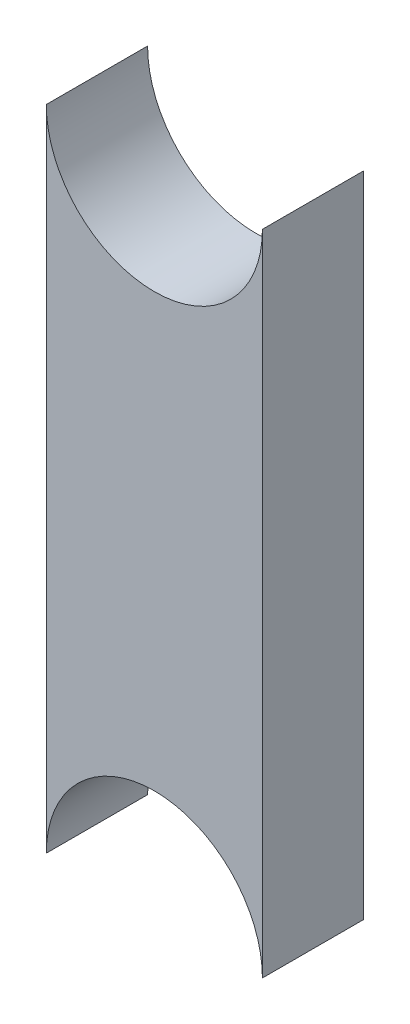
ISO-10303-21;
HEADER;
FILE_DESCRIPTION(('STEP AP214'),'2;1');
FILE_NAME('part.step','',(''),(''),'','','');
FILE_SCHEMA(('AUTOMOTIVE_DESIGN { 1 0 10303 214 1 1 1 1 }'));
ENDSEC;
DATA;
#1=APPLICATION_CONTEXT('core data for automotive mechanical design processes');
#2=APPLICATION_PROTOCOL_DEFINITION('international standard','automotive_design',2000,#1);
#3=PRODUCT_CONTEXT('',#1,'mechanical');
#4=PRODUCT('Part','Part','',(#3));
#5=PRODUCT_RELATED_PRODUCT_CATEGORY('part','',(#4));
#6=PRODUCT_DEFINITION_FORMATION('','',#4);
#7=PRODUCT_DEFINITION_CONTEXT('part definition',#1,'design');
#8=PRODUCT_DEFINITION('design','',#6,#7);
#9=PRODUCT_DEFINITION_SHAPE('','',#8);
#10=(LENGTH_UNIT() NAMED_UNIT(*) SI_UNIT(.MILLI.,.METRE.));
#11=(NAMED_UNIT(*) PLANE_ANGLE_UNIT() SI_UNIT($,.RADIAN.));
#12=(NAMED_UNIT(*) SI_UNIT($,.STERADIAN.) SOLID_ANGLE_UNIT());
#13=UNCERTAINTY_MEASURE_WITH_UNIT(LENGTH_MEASURE(1.E-05),#10,'distance_accuracy_value','');
#14=(GEOMETRIC_REPRESENTATION_CONTEXT(3) GLOBAL_UNCERTAINTY_ASSIGNED_CONTEXT((#13)) GLOBAL_UNIT_ASSIGNED_CONTEXT((#10,
#11,#12)) REPRESENTATION_CONTEXT('',''));
#15=CARTESIAN_POINT('',(0.,0.,0.));
#16=DIRECTION('',(0.,0.,1.));
#17=DIRECTION('',(1.,0.,0.));
#18=AXIS2_PLACEMENT_3D('',#15,#16,#17);
#19=CARTESIAN_POINT('',(0.,19.2,3.));
#20=DIRECTION('',(0.,0.,-1.));
#21=DIRECTION('',(-1.,0.,0.));
#22=AXIS2_PLACEMENT_3D('',#19,#20,#21);
#23=CYLINDRICAL_SURFACE('',#22,3.2);
#24=CARTESIAN_POINT('',(0.,19.2,0.));
#25=DIRECTION('',(0.,0.,-1.));
#26=DIRECTION('',(1.,0.,0.));
#27=AXIS2_PLACEMENT_3D('',#24,#25,#26);
#28=CIRCLE('',#27,3.2);
#29=CARTESIAN_POINT('',(3.2,19.2,0.));
#30=VERTEX_POINT('',#29);
#31=CARTESIAN_POINT('',(-3.2,19.2,0.));
#32=VERTEX_POINT('',#31);
#33=EDGE_CURVE('E102',#30,#32,#28,.T.);
#34=ORIENTED_EDGE('',*,*,#33,.T.);
#35=DIRECTION('',(0.,0.,-1.));
#36=VECTOR('',#35,1.);
#37=CARTESIAN_POINT('',(-3.2,19.2,3.));
#38=LINE('',#37,#36);
#39=CARTESIAN_POINT('',(-3.2,19.2,3.));
#40=VERTEX_POINT('',#39);
#41=EDGE_CURVE('E11',#40,#32,#38,.T.);
#42=ORIENTED_EDGE('',*,*,#41,.F.);
#43=CARTESIAN_POINT('',(0.,19.2,3.));
#44=DIRECTION('',(0.,0.,-1.));
#45=DIRECTION('',(1.,0.,0.));
#46=AXIS2_PLACEMENT_3D('',#43,#44,#45);
#47=CIRCLE('',#46,3.2);
#48=CARTESIAN_POINT('',(3.2,19.2,3.));
#49=VERTEX_POINT('',#48);
#50=EDGE_CURVE('E90',#49,#40,#47,.T.);
#51=ORIENTED_EDGE('',*,*,#50,.F.);
#52=DIRECTION('',(0.,0.,-1.));
#53=VECTOR('',#52,1.);
#54=CARTESIAN_POINT('',(3.2,19.2,3.));
#55=LINE('',#54,#53);
#56=EDGE_CURVE('E98',#49,#30,#55,.T.);
#57=ORIENTED_EDGE('',*,*,#56,.T.);
#58=EDGE_LOOP('',(#34,#42,#51,#57));
#59=FACE_BOUND('',#58,.T.);
#60=ADVANCED_FACE('F39',(#59),#23,.F.);
#61=CARTESIAN_POINT('',(-3.2,0.,3.));
#62=DIRECTION('',(1.,0.,0.));
#63=DIRECTION('',(0.,0.,-1.));
#64=AXIS2_PLACEMENT_3D('',#61,#62,#63);
#65=PLANE('',#64);
#66=DIRECTION('',(0.,-1.,0.));
#67=VECTOR('',#66,1.);
#68=CARTESIAN_POINT('',(-3.2,0.,0.));
#69=LINE('',#68,#67);
#70=CARTESIAN_POINT('',(-3.2,0.,0.));
#71=VERTEX_POINT('',#70);
#72=EDGE_CURVE('E94',#32,#71,#69,.T.);
#73=ORIENTED_EDGE('',*,*,#72,.T.);
#74=DIRECTION('',(0.,0.,-1.));
#75=VECTOR('',#74,1.);
#76=CARTESIAN_POINT('',(-3.2,0.,3.));
#77=LINE('',#76,#75);
#78=CARTESIAN_POINT('',(-3.2,0.,3.));
#79=VERTEX_POINT('',#78);
#80=EDGE_CURVE('E47',#79,#71,#77,.T.);
#81=ORIENTED_EDGE('',*,*,#80,.F.);
#82=DIRECTION('',(0.,-1.,0.));
#83=VECTOR('',#82,1.);
#84=CARTESIAN_POINT('',(-3.2,0.,3.));
#85=LINE('',#84,#83);
#86=EDGE_CURVE('E85',#40,#79,#85,.T.);
#87=ORIENTED_EDGE('',*,*,#86,.F.);
#88=ORIENTED_EDGE('',*,*,#41,.T.);
#89=EDGE_LOOP('',(#73,#81,#87,#88));
#90=FACE_BOUND('',#89,.T.);
#91=ADVANCED_FACE('F93',(#90),#65,.F.);
#92=CARTESIAN_POINT('',(0.,0.,3.));
#93=DIRECTION('',(0.,0.,-1.));
#94=DIRECTION('',(-1.,0.,0.));
#95=AXIS2_PLACEMENT_3D('',#92,#93,#94);
#96=CYLINDRICAL_SURFACE('',#95,3.2);
#97=CARTESIAN_POINT('',(0.,0.,0.));
#98=DIRECTION('',(0.,0.,-1.));
#99=DIRECTION('',(1.,0.,0.));
#100=AXIS2_PLACEMENT_3D('',#97,#98,#99);
#101=CIRCLE('',#100,3.2);
#102=CARTESIAN_POINT('',(3.2,0.,0.));
#103=VERTEX_POINT('',#102);
#104=EDGE_CURVE('E72',#71,#103,#101,.T.);
#105=ORIENTED_EDGE('',*,*,#104,.T.);
#106=DIRECTION('',(0.,0.,-1.));
#107=VECTOR('',#106,1.);
#108=CARTESIAN_POINT('',(3.2,0.,3.));
#109=LINE('',#108,#107);
#110=CARTESIAN_POINT('',(3.2,0.,3.));
#111=VERTEX_POINT('',#110);
#112=EDGE_CURVE('E95',#111,#103,#109,.T.);
#113=ORIENTED_EDGE('',*,*,#112,.F.);
#114=CARTESIAN_POINT('',(0.,0.,3.));
#115=DIRECTION('',(0.,0.,-1.));
#116=DIRECTION('',(1.,0.,0.));
#117=AXIS2_PLACEMENT_3D('',#114,#115,#116);
#118=CIRCLE('',#117,3.2);
#119=EDGE_CURVE('E88',#79,#111,#118,.T.);
#120=ORIENTED_EDGE('',*,*,#119,.F.);
#121=ORIENTED_EDGE('',*,*,#80,.T.);
#122=EDGE_LOOP('',(#105,#113,#120,#121));
#123=FACE_BOUND('',#122,.T.);
#124=ADVANCED_FACE('F96',(#123),#96,.F.);
#125=CARTESIAN_POINT('',(3.2,19.2,3.));
#126=DIRECTION('',(-1.,0.,0.));
#127=DIRECTION('',(0.,-1.,0.));
#128=AXIS2_PLACEMENT_3D('',#125,#126,#127);
#129=PLANE('',#128);
#130=DIRECTION('',(0.,1.,0.));
#131=VECTOR('',#130,1.);
#132=CARTESIAN_POINT('',(3.2,19.2,0.));
#133=LINE('',#132,#131);
#134=EDGE_CURVE('E78',#103,#30,#133,.T.);
#135=ORIENTED_EDGE('',*,*,#134,.T.);
#136=ORIENTED_EDGE('',*,*,#56,.F.);
#137=DIRECTION('',(0.,1.,0.));
#138=VECTOR('',#137,1.);
#139=CARTESIAN_POINT('',(3.2,19.2,3.));
#140=LINE('',#139,#138);
#141=EDGE_CURVE('E55',#111,#49,#140,.T.);
#142=ORIENTED_EDGE('',*,*,#141,.F.);
#143=ORIENTED_EDGE('',*,*,#112,.T.);
#144=EDGE_LOOP('',(#135,#136,#142,#143));
#145=FACE_BOUND('',#144,.T.);
#146=ADVANCED_FACE('F109',(#145),#129,.F.);
#147=CARTESIAN_POINT('',(0.,19.2,3.));
#148=DIRECTION('',(0.,0.,1.));
#149=DIRECTION('',(1.,0.,0.));
#150=AXIS2_PLACEMENT_3D('',#147,#148,#149);
#151=PLANE('',#150);
#152=ORIENTED_EDGE('',*,*,#50,.T.);
#153=ORIENTED_EDGE('',*,*,#86,.T.);
#154=ORIENTED_EDGE('',*,*,#119,.T.);
#155=ORIENTED_EDGE('',*,*,#141,.T.);
#156=EDGE_LOOP('',(#152,#153,#154,#155));
#157=FACE_BOUND('',#156,.T.);
#158=ADVANCED_FACE('F86',(#157),#151,.T.);
#159=CARTESIAN_POINT('',(0.,19.2,0.));
#160=DIRECTION('',(0.,0.,1.));
#161=DIRECTION('',(1.,0.,0.));
#162=AXIS2_PLACEMENT_3D('',#159,#160,#161);
#163=PLANE('',#162);
#164=ORIENTED_EDGE('',*,*,#33,.F.);
#165=ORIENTED_EDGE('',*,*,#134,.F.);
#166=ORIENTED_EDGE('',*,*,#104,.F.);
#167=ORIENTED_EDGE('',*,*,#72,.F.);
#168=EDGE_LOOP('',(#164,#165,#166,#167));
#169=FACE_BOUND('',#168,.T.);
#170=ADVANCED_FACE('F112',(#169),#163,.F.);
#171=CLOSED_SHELL('',(#60,#91,#124,#146,#158,#170));
#172=MANIFOLD_SOLID_BREP('B2',#171);
#173=ADVANCED_BREP_SHAPE_REPRESENTATION('',(#18,#172),#14);
#174=SHAPE_DEFINITION_REPRESENTATION(#9,#173);
ENDSEC;
END-ISO-10303-21;
